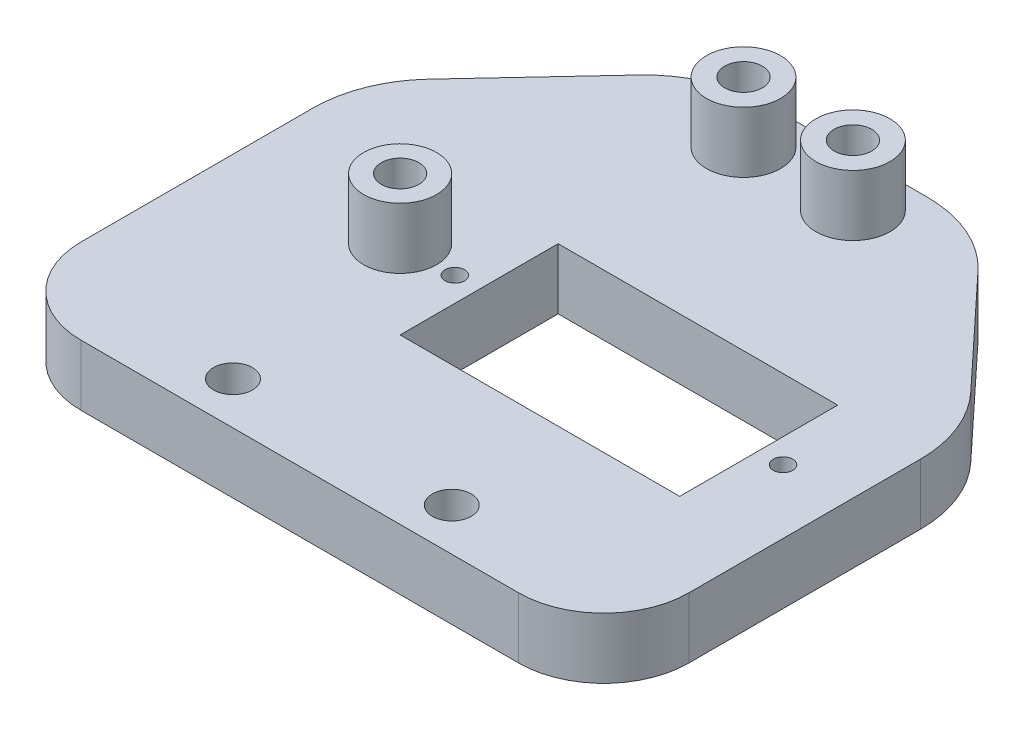
ISO-10303-21;
HEADER;
FILE_DESCRIPTION(('STEP AP214'),'2;1');
FILE_NAME('part.step','',(''),(''),'','','');
FILE_SCHEMA(('AUTOMOTIVE_DESIGN { 1 0 10303 214 1 1 1 1 }'));
ENDSEC;
DATA;
#1=APPLICATION_CONTEXT('core data for automotive mechanical design processes');
#2=APPLICATION_PROTOCOL_DEFINITION('international standard','automotive_design',2000,#1);
#3=PRODUCT_CONTEXT('',#1,'mechanical');
#4=PRODUCT('Part','Part','',(#3));
#5=PRODUCT_RELATED_PRODUCT_CATEGORY('part','',(#4));
#6=PRODUCT_DEFINITION_FORMATION('','',#4);
#7=PRODUCT_DEFINITION_CONTEXT('part definition',#1,'design');
#8=PRODUCT_DEFINITION('design','',#6,#7);
#9=PRODUCT_DEFINITION_SHAPE('','',#8);
#10=(LENGTH_UNIT() NAMED_UNIT(*) SI_UNIT(.MILLI.,.METRE.));
#11=(NAMED_UNIT(*) PLANE_ANGLE_UNIT() SI_UNIT($,.RADIAN.));
#12=(NAMED_UNIT(*) SI_UNIT($,.STERADIAN.) SOLID_ANGLE_UNIT());
#13=UNCERTAINTY_MEASURE_WITH_UNIT(LENGTH_MEASURE(1.E-05),#10,'distance_accuracy_value','');
#14=(GEOMETRIC_REPRESENTATION_CONTEXT(3) GLOBAL_UNCERTAINTY_ASSIGNED_CONTEXT((#13)) GLOBAL_UNIT_ASSIGNED_CONTEXT((#10,
#11,#12)) REPRESENTATION_CONTEXT('',''));
#15=CARTESIAN_POINT('',(0.,0.,0.));
#16=DIRECTION('',(0.,0.,1.));
#17=DIRECTION('',(1.,0.,0.));
#18=AXIS2_PLACEMENT_3D('',#15,#16,#17);
#19=CARTESIAN_POINT('',(0.,5.,0.));
#20=DIRECTION('',(0.,1.,0.));
#21=DIRECTION('',(0.,0.,1.));
#22=AXIS2_PLACEMENT_3D('',#19,#20,#21);
#23=PLANE('',#22);
#24=CARTESIAN_POINT('',(9.,5.,11.5));
#25=DIRECTION('',(0.,-1.,0.));
#26=DIRECTION('',(0.,0.,-1.));
#27=AXIS2_PLACEMENT_3D('',#24,#25,#26);
#28=CIRCLE('',#27,1.6);
#29=CARTESIAN_POINT('',(9.,5.,9.9));
#30=VERTEX_POINT('',#29);
#31=EDGE_CURVE('E505',#30,#30,#28,.T.);
#32=ORIENTED_EDGE('',*,*,#31,.T.);
#33=EDGE_LOOP('',(#32));
#34=FACE_BOUND('',#33,.T.);
#35=CARTESIAN_POINT('',(-4.5,5.,-26.));
#36=DIRECTION('',(0.,1.,0.));
#37=DIRECTION('',(0.,0.,1.));
#38=AXIS2_PLACEMENT_3D('',#35,#36,#37);
#39=CIRCLE('',#38,3.05);
#40=CARTESIAN_POINT('',(-4.5,5.,-22.95));
#41=VERTEX_POINT('',#40);
#42=EDGE_CURVE('E448',#41,#41,#39,.T.);
#43=ORIENTED_EDGE('',*,*,#42,.F.);
#44=EDGE_LOOP('',(#43));
#45=FACE_BOUND('',#44,.T.);
#46=CARTESIAN_POINT('',(-11.75,5.,-5.));
#47=DIRECTION('',(0.,1.,0.));
#48=DIRECTION('',(0.,0.,1.));
#49=AXIS2_PLACEMENT_3D('',#46,#47,#48);
#50=CIRCLE('',#49,3.);
#51=CARTESIAN_POINT('',(-11.75,5.,-2.));
#52=VERTEX_POINT('',#51);
#53=EDGE_CURVE('E440',#52,#52,#50,.T.);
#54=ORIENTED_EDGE('',*,*,#53,.F.);
#55=EDGE_LOOP('',(#54));
#56=FACE_BOUND('',#55,.T.);
#57=CARTESIAN_POINT('',(-7.25,5.,-5.));
#58=DIRECTION('',(0.,-1.,0.));
#59=DIRECTION('',(0.,0.,1.));
#60=AXIS2_PLACEMENT_3D('',#57,#58,#59);
#61=CIRCLE('',#60,0.799999999999999);
#62=CARTESIAN_POINT('',(-7.25,5.,-4.2));
#63=VERTEX_POINT('',#62);
#64=EDGE_CURVE('E443',#63,#63,#61,.T.);
#65=ORIENTED_EDGE('',*,*,#64,.T.);
#66=EDGE_LOOP('',(#65));
#67=FACE_BOUND('',#66,.T.);
#68=CARTESIAN_POINT('',(19.75,5.,-4.99999999999999));
#69=DIRECTION('',(0.,-1.,0.));
#70=DIRECTION('',(0.,0.,-1.));
#71=AXIS2_PLACEMENT_3D('',#68,#69,#70);
#72=CIRCLE('',#71,0.799999999999999);
#73=CARTESIAN_POINT('',(19.75,5.,-5.79999999999999));
#74=VERTEX_POINT('',#73);
#75=EDGE_CURVE('E197',#74,#74,#72,.T.);
#76=ORIENTED_EDGE('',*,*,#75,.T.);
#77=EDGE_LOOP('',(#76));
#78=FACE_BOUND('',#77,.T.);
#79=DIRECTION('',(0.,0.,-1.));
#80=VECTOR('',#79,1.);
#81=CARTESIAN_POINT('',(-5.25,5.,1.5));
#82=LINE('',#81,#80);
#83=CARTESIAN_POINT('',(-5.25,5.,1.5));
#84=VERTEX_POINT('',#83);
#85=CARTESIAN_POINT('',(-5.25,5.,-11.5));
#86=VERTEX_POINT('',#85);
#87=EDGE_CURVE('E165',#84,#86,#82,.T.);
#88=ORIENTED_EDGE('',*,*,#87,.T.);
#89=DIRECTION('',(1.,0.,0.));
#90=VECTOR('',#89,1.);
#91=CARTESIAN_POINT('',(-5.25,5.,-11.5));
#92=LINE('',#91,#90);
#93=CARTESIAN_POINT('',(17.75,5.,-11.5));
#94=VERTEX_POINT('',#93);
#95=EDGE_CURVE('E177',#86,#94,#92,.T.);
#96=ORIENTED_EDGE('',*,*,#95,.T.);
#97=DIRECTION('',(0.,0.,1.));
#98=VECTOR('',#97,1.);
#99=CARTESIAN_POINT('',(17.75,5.,1.5));
#100=LINE('',#99,#98);
#101=CARTESIAN_POINT('',(17.75,5.,1.5));
#102=VERTEX_POINT('',#101);
#103=EDGE_CURVE('E181',#94,#102,#100,.T.);
#104=ORIENTED_EDGE('',*,*,#103,.T.);
#105=DIRECTION('',(-1.,0.,0.));
#106=VECTOR('',#105,1.);
#107=CARTESIAN_POINT('',(-5.25,5.,1.5));
#108=LINE('',#107,#106);
#109=EDGE_CURVE('E173',#102,#84,#108,.T.);
#110=ORIENTED_EDGE('',*,*,#109,.T.);
#111=EDGE_LOOP('',(#88,#96,#104,#110));
#112=FACE_BOUND('',#111,.T.);
#113=DIRECTION('',(0.,0.,1.));
#114=VECTOR('',#113,1.);
#115=CARTESIAN_POINT('',(-25.,5.,-15.));
#116=LINE('',#115,#114);
#117=CARTESIAN_POINT('',(-25.,5.,-11.0583681937977));
#118=VERTEX_POINT('',#117);
#119=CARTESIAN_POINT('',(-25.,5.,8.));
#120=VERTEX_POINT('',#119);
#121=EDGE_CURVE('E228',#118,#120,#116,.T.);
#122=ORIENTED_EDGE('',*,*,#121,.T.);
#123=CARTESIAN_POINT('',(-18.,5.,8.));
#124=DIRECTION('',(0.,1.,0.));
#125=DIRECTION('',(0.,0.,1.));
#126=AXIS2_PLACEMENT_3D('',#123,#124,#125);
#127=CIRCLE('',#126,7.);
#128=CARTESIAN_POINT('',(-18.,5.,15.));
#129=VERTEX_POINT('',#128);
#130=EDGE_CURVE('E53',#120,#129,#127,.T.);
#131=ORIENTED_EDGE('',*,*,#130,.T.);
#132=DIRECTION('',(1.,0.,0.));
#133=VECTOR('',#132,1.);
#134=CARTESIAN_POINT('',(-25.,5.,15.));
#135=LINE('',#134,#133);
#136=CARTESIAN_POINT('',(18.,5.,15.));
#137=VERTEX_POINT('',#136);
#138=EDGE_CURVE('E230',#129,#137,#135,.T.);
#139=ORIENTED_EDGE('',*,*,#138,.T.);
#140=CARTESIAN_POINT('',(18.,5.,8.));
#141=DIRECTION('',(0.,1.,0.));
#142=DIRECTION('',(0.,0.,1.));
#143=AXIS2_PLACEMENT_3D('',#140,#141,#142);
#144=CIRCLE('',#143,7.);
#145=CARTESIAN_POINT('',(25.,5.,8.));
#146=VERTEX_POINT('',#145);
#147=EDGE_CURVE('E60',#137,#146,#144,.T.);
#148=ORIENTED_EDGE('',*,*,#147,.T.);
#149=DIRECTION('',(0.,0.,-1.));
#150=VECTOR('',#149,1.);
#151=CARTESIAN_POINT('',(25.,5.,-15.));
#152=LINE('',#151,#150);
#153=CARTESIAN_POINT('',(25.,5.,-11.0583681937977));
#154=VERTEX_POINT('',#153);
#155=EDGE_CURVE('E216',#146,#154,#152,.T.);
#156=ORIENTED_EDGE('',*,*,#155,.T.);
#157=CARTESIAN_POINT('',(15.,5.,-11.0583681937977));
#158=DIRECTION('',(0.,1.,0.));
#159=DIRECTION('',(0.,0.,1.));
#160=AXIS2_PLACEMENT_3D('',#157,#158,#159);
#161=CIRCLE('',#160,10.);
#162=CARTESIAN_POINT('',(22.3105526824287,5.,-17.8815506973978));
#163=VERTEX_POINT('',#162);
#164=EDGE_CURVE('E269',#154,#163,#161,.T.);
#165=ORIENTED_EDGE('',*,*,#164,.T.);
#166=DIRECTION('',(-0.682318250360011,0.,-0.731055268242869));
#167=VECTOR('',#166,1.);
#168=CARTESIAN_POINT('',(11.,5.,-30.));
#169=LINE('',#168,#167);
#170=CARTESIAN_POINT('',(13.9650296633066,5.,-26.8231825036001));
#171=VERTEX_POINT('',#170);
#172=EDGE_CURVE('E218',#163,#171,#169,.T.);
#173=ORIENTED_EDGE('',*,*,#172,.T.);
#174=CARTESIAN_POINT('',(6.65447698087787,5.,-20.));
#175=DIRECTION('',(0.,1.,0.));
#176=DIRECTION('',(0.,0.,1.));
#177=AXIS2_PLACEMENT_3D('',#174,#175,#176);
#178=CIRCLE('',#177,10.);
#179=CARTESIAN_POINT('',(6.65447698087787,5.,-30.));
#180=VERTEX_POINT('',#179);
#181=EDGE_CURVE('E267',#171,#180,#178,.T.);
#182=ORIENTED_EDGE('',*,*,#181,.T.);
#183=DIRECTION('',(-1.,0.,0.));
#184=VECTOR('',#183,1.);
#185=CARTESIAN_POINT('',(-11.,5.,-30.));
#186=LINE('',#185,#184);
#187=CARTESIAN_POINT('',(-6.65447698087788,5.,-30.));
#188=VERTEX_POINT('',#187);
#189=EDGE_CURVE('E222',#180,#188,#186,.T.);
#190=ORIENTED_EDGE('',*,*,#189,.T.);
#191=CARTESIAN_POINT('',(-6.65447698087788,5.,-20.));
#192=DIRECTION('',(0.,1.,0.));
#193=DIRECTION('',(0.,0.,1.));
#194=AXIS2_PLACEMENT_3D('',#191,#192,#193);
#195=CIRCLE('',#194,10.);
#196=CARTESIAN_POINT('',(-13.9650296633066,5.,-26.8231825036001));
#197=VERTEX_POINT('',#196);
#198=EDGE_CURVE('E265',#188,#197,#195,.T.);
#199=ORIENTED_EDGE('',*,*,#198,.T.);
#200=DIRECTION('',(-0.682318250360011,0.,0.731055268242869));
#201=VECTOR('',#200,1.);
#202=CARTESIAN_POINT('',(-11.,5.,-30.));
#203=LINE('',#202,#201);
#204=CARTESIAN_POINT('',(-22.3105526824287,5.,-17.8815506973978));
#205=VERTEX_POINT('',#204);
#206=EDGE_CURVE('E225',#197,#205,#203,.T.);
#207=ORIENTED_EDGE('',*,*,#206,.T.);
#208=CARTESIAN_POINT('',(-15.,5.,-11.0583681937977));
#209=DIRECTION('',(0.,1.,0.));
#210=DIRECTION('',(0.,0.,1.));
#211=AXIS2_PLACEMENT_3D('',#208,#209,#210);
#212=CIRCLE('',#211,10.);
#213=EDGE_CURVE('E263',#205,#118,#212,.T.);
#214=ORIENTED_EDGE('',*,*,#213,.T.);
#215=EDGE_LOOP('',(#122,#131,#139,#148,#156,#165,#173,#182,#190,#199,#207,#214));
#216=FACE_BOUND('',#215,.T.);
#217=CARTESIAN_POINT('',(4.5,5.,-26.));
#218=DIRECTION('',(0.,1.,0.));
#219=DIRECTION('',(0.,0.,1.));
#220=AXIS2_PLACEMENT_3D('',#217,#218,#219);
#221=CIRCLE('',#220,3.05);
#222=CARTESIAN_POINT('',(4.5,5.,-22.95));
#223=VERTEX_POINT('',#222);
#224=EDGE_CURVE('E498',#223,#223,#221,.T.);
#225=ORIENTED_EDGE('',*,*,#224,.F.);
#226=EDGE_LOOP('',(#225));
#227=FACE_BOUND('',#226,.T.);
#228=CARTESIAN_POINT('',(-9.,5.,11.5));
#229=DIRECTION('',(0.,1.,0.));
#230=DIRECTION('',(0.,0.,1.));
#231=AXIS2_PLACEMENT_3D('',#228,#229,#230);
#232=CIRCLE('',#231,1.6);
#233=CARTESIAN_POINT('',(-9.,5.,13.1));
#234=VERTEX_POINT('',#233);
#235=EDGE_CURVE('E289',#234,#234,#232,.T.);
#236=ORIENTED_EDGE('',*,*,#235,.F.);
#237=EDGE_LOOP('',(#236));
#238=FACE_BOUND('',#237,.T.);
#239=ADVANCED_FACE('F45',(#34,#45,#56,#67,#78,#112,#216,#227,#238),#23,.T.);
#240=CARTESIAN_POINT('',(0.,0.,0.));
#241=DIRECTION('',(0.,1.,0.));
#242=DIRECTION('',(0.,0.,1.));
#243=AXIS2_PLACEMENT_3D('',#240,#241,#242);
#244=PLANE('',#243);
#245=CARTESIAN_POINT('',(9.,0.,11.5));
#246=DIRECTION('',(0.,1.,0.));
#247=DIRECTION('',(0.,0.,1.));
#248=AXIS2_PLACEMENT_3D('',#245,#246,#247);
#249=CIRCLE('',#248,1.90000000000001);
#250=CARTESIAN_POINT('',(9.,0.,13.4));
#251=VERTEX_POINT('',#250);
#252=EDGE_CURVE('E295',#251,#251,#249,.T.);
#253=ORIENTED_EDGE('',*,*,#252,.T.);
#254=EDGE_LOOP('',(#253));
#255=FACE_BOUND('',#254,.T.);
#256=CARTESIAN_POINT('',(-9.,0.,11.5));
#257=DIRECTION('',(0.,1.,0.));
#258=DIRECTION('',(0.,0.,1.));
#259=AXIS2_PLACEMENT_3D('',#256,#257,#258);
#260=CIRCLE('',#259,1.89999999999999);
#261=CARTESIAN_POINT('',(-9.,0.,13.4));
#262=VERTEX_POINT('',#261);
#263=EDGE_CURVE('E292',#262,#262,#260,.T.);
#264=ORIENTED_EDGE('',*,*,#263,.T.);
#265=EDGE_LOOP('',(#264));
#266=FACE_BOUND('',#265,.T.);
#267=CARTESIAN_POINT('',(-11.75,0.,-5.));
#268=DIRECTION('',(0.,1.,0.));
#269=DIRECTION('',(0.,0.,1.));
#270=AXIS2_PLACEMENT_3D('',#267,#268,#269);
#271=CIRCLE('',#270,1.55);
#272=CARTESIAN_POINT('',(-11.75,0.,-3.45));
#273=VERTEX_POINT('',#272);
#274=EDGE_CURVE('E210',#273,#273,#271,.T.);
#275=ORIENTED_EDGE('',*,*,#274,.T.);
#276=EDGE_LOOP('',(#275));
#277=FACE_BOUND('',#276,.T.);
#278=DIRECTION('',(1.,0.,0.));
#279=VECTOR('',#278,1.);
#280=CARTESIAN_POINT('',(-25.,0.,15.));
#281=LINE('',#280,#279);
#282=CARTESIAN_POINT('',(-18.,0.,15.));
#283=VERTEX_POINT('',#282);
#284=CARTESIAN_POINT('',(18.,0.,15.));
#285=VERTEX_POINT('',#284);
#286=EDGE_CURVE('E219',#283,#285,#281,.T.);
#287=ORIENTED_EDGE('',*,*,#286,.F.);
#288=CARTESIAN_POINT('',(-18.,0.,8.));
#289=DIRECTION('',(0.,1.,0.));
#290=DIRECTION('',(0.,0.,1.));
#291=AXIS2_PLACEMENT_3D('',#288,#289,#290);
#292=CIRCLE('',#291,7.);
#293=CARTESIAN_POINT('',(-25.,0.,8.));
#294=VERTEX_POINT('',#293);
#295=EDGE_CURVE('E308',#283,#294,#292,.F.);
#296=ORIENTED_EDGE('',*,*,#295,.T.);
#297=DIRECTION('',(0.,0.,1.));
#298=VECTOR('',#297,1.);
#299=CARTESIAN_POINT('',(-25.,0.,-15.));
#300=LINE('',#299,#298);
#301=CARTESIAN_POINT('',(-25.,0.,-11.0583681937977));
#302=VERTEX_POINT('',#301);
#303=EDGE_CURVE('E243',#302,#294,#300,.T.);
#304=ORIENTED_EDGE('',*,*,#303,.F.);
#305=CARTESIAN_POINT('',(-15.,0.,-11.0583681937977));
#306=DIRECTION('',(0.,1.,0.));
#307=DIRECTION('',(0.,0.,1.));
#308=AXIS2_PLACEMENT_3D('',#305,#306,#307);
#309=CIRCLE('',#308,10.);
#310=CARTESIAN_POINT('',(-22.3105526824287,0.,-17.8815506973978));
#311=VERTEX_POINT('',#310);
#312=EDGE_CURVE('E251',#302,#311,#309,.F.);
#313=ORIENTED_EDGE('',*,*,#312,.T.);
#314=DIRECTION('',(-0.682318250360011,0.,0.731055268242869));
#315=VECTOR('',#314,1.);
#316=CARTESIAN_POINT('',(-11.,0.,-30.));
#317=LINE('',#316,#315);
#318=CARTESIAN_POINT('',(-13.9650296633066,0.,-26.8231825036001));
#319=VERTEX_POINT('',#318);
#320=EDGE_CURVE('E240',#319,#311,#317,.T.);
#321=ORIENTED_EDGE('',*,*,#320,.F.);
#322=CARTESIAN_POINT('',(-6.65447698087788,0.,-20.));
#323=DIRECTION('',(0.,1.,0.));
#324=DIRECTION('',(0.,0.,1.));
#325=AXIS2_PLACEMENT_3D('',#322,#323,#324);
#326=CIRCLE('',#325,10.);
#327=CARTESIAN_POINT('',(-6.65447698087788,0.,-30.));
#328=VERTEX_POINT('',#327);
#329=EDGE_CURVE('E253',#319,#328,#326,.F.);
#330=ORIENTED_EDGE('',*,*,#329,.T.);
#331=DIRECTION('',(-1.,0.,0.));
#332=VECTOR('',#331,1.);
#333=CARTESIAN_POINT('',(-11.,0.,-30.));
#334=LINE('',#333,#332);
#335=CARTESIAN_POINT('',(6.65447698087787,0.,-30.));
#336=VERTEX_POINT('',#335);
#337=EDGE_CURVE('E237',#336,#328,#334,.T.);
#338=ORIENTED_EDGE('',*,*,#337,.F.);
#339=CARTESIAN_POINT('',(6.65447698087787,0.,-20.));
#340=DIRECTION('',(0.,1.,0.));
#341=DIRECTION('',(0.,0.,1.));
#342=AXIS2_PLACEMENT_3D('',#339,#340,#341);
#343=CIRCLE('',#342,10.);
#344=CARTESIAN_POINT('',(13.9650296633066,0.,-26.8231825036001));
#345=VERTEX_POINT('',#344);
#346=EDGE_CURVE('E255',#336,#345,#343,.F.);
#347=ORIENTED_EDGE('',*,*,#346,.T.);
#348=DIRECTION('',(-0.682318250360011,0.,-0.731055268242869));
#349=VECTOR('',#348,1.);
#350=CARTESIAN_POINT('',(11.,0.,-30.));
#351=LINE('',#350,#349);
#352=CARTESIAN_POINT('',(22.3105526824287,0.,-17.8815506973978));
#353=VERTEX_POINT('',#352);
#354=EDGE_CURVE('E234',#353,#345,#351,.T.);
#355=ORIENTED_EDGE('',*,*,#354,.F.);
#356=CARTESIAN_POINT('',(15.,0.,-11.0583681937977));
#357=DIRECTION('',(0.,1.,0.));
#358=DIRECTION('',(0.,0.,1.));
#359=AXIS2_PLACEMENT_3D('',#356,#357,#358);
#360=CIRCLE('',#359,10.);
#361=CARTESIAN_POINT('',(25.,0.,-11.0583681937977));
#362=VERTEX_POINT('',#361);
#363=EDGE_CURVE('E257',#353,#362,#360,.F.);
#364=ORIENTED_EDGE('',*,*,#363,.T.);
#365=DIRECTION('',(0.,0.,-1.));
#366=VECTOR('',#365,1.);
#367=CARTESIAN_POINT('',(25.,0.,-15.));
#368=LINE('',#367,#366);
#369=CARTESIAN_POINT('',(25.,0.,8.));
#370=VERTEX_POINT('',#369);
#371=EDGE_CURVE('E215',#370,#362,#368,.T.);
#372=ORIENTED_EDGE('',*,*,#371,.F.);
#373=CARTESIAN_POINT('',(18.,0.,8.));
#374=DIRECTION('',(0.,1.,0.));
#375=DIRECTION('',(0.,0.,1.));
#376=AXIS2_PLACEMENT_3D('',#373,#374,#375);
#377=CIRCLE('',#376,7.);
#378=EDGE_CURVE('E306',#370,#285,#377,.F.);
#379=ORIENTED_EDGE('',*,*,#378,.T.);
#380=EDGE_LOOP('',(#287,#296,#304,#313,#321,#330,#338,#347,#355,#364,#372,#379));
#381=FACE_BOUND('',#380,.T.);
#382=CARTESIAN_POINT('',(4.5,0.,-26.));
#383=DIRECTION('',(0.,1.,0.));
#384=DIRECTION('',(0.,0.,-1.));
#385=AXIS2_PLACEMENT_3D('',#382,#383,#384);
#386=CIRCLE('',#385,1.55);
#387=CARTESIAN_POINT('',(4.5,0.,-27.55));
#388=VERTEX_POINT('',#387);
#389=EDGE_CURVE('E203',#388,#388,#386,.T.);
#390=ORIENTED_EDGE('',*,*,#389,.T.);
#391=EDGE_LOOP('',(#390));
#392=FACE_BOUND('',#391,.T.);
#393=CARTESIAN_POINT('',(-4.5,0.,-26.));
#394=DIRECTION('',(0.,1.,0.));
#395=DIRECTION('',(0.,0.,1.));
#396=AXIS2_PLACEMENT_3D('',#393,#394,#395);
#397=CIRCLE('',#396,1.55);
#398=CARTESIAN_POINT('',(-4.5,0.,-24.45));
#399=VERTEX_POINT('',#398);
#400=EDGE_CURVE('E207',#399,#399,#397,.T.);
#401=ORIENTED_EDGE('',*,*,#400,.T.);
#402=EDGE_LOOP('',(#401));
#403=FACE_BOUND('',#402,.T.);
#404=DIRECTION('',(1.,0.,0.));
#405=VECTOR('',#404,1.);
#406=CARTESIAN_POINT('',(-5.25,0.,-11.5));
#407=LINE('',#406,#405);
#408=CARTESIAN_POINT('',(-5.25,0.,-11.5));
#409=VERTEX_POINT('',#408);
#410=CARTESIAN_POINT('',(17.75,0.,-11.5));
#411=VERTEX_POINT('',#410);
#412=EDGE_CURVE('E196',#409,#411,#407,.T.);
#413=ORIENTED_EDGE('',*,*,#412,.F.);
#414=DIRECTION('',(0.,0.,-1.));
#415=VECTOR('',#414,1.);
#416=CARTESIAN_POINT('',(-5.25,0.,1.5));
#417=LINE('',#416,#415);
#418=CARTESIAN_POINT('',(-5.25,0.,1.5));
#419=VERTEX_POINT('',#418);
#420=EDGE_CURVE('E168',#419,#409,#417,.T.);
#421=ORIENTED_EDGE('',*,*,#420,.F.);
#422=DIRECTION('',(-1.,0.,0.));
#423=VECTOR('',#422,1.);
#424=CARTESIAN_POINT('',(-5.25,0.,1.5));
#425=LINE('',#424,#423);
#426=CARTESIAN_POINT('',(17.75,0.,1.5));
#427=VERTEX_POINT('',#426);
#428=EDGE_CURVE('E184',#427,#419,#425,.T.);
#429=ORIENTED_EDGE('',*,*,#428,.F.);
#430=DIRECTION('',(0.,0.,1.));
#431=VECTOR('',#430,1.);
#432=CARTESIAN_POINT('',(17.75,0.,1.5));
#433=LINE('',#432,#431);
#434=EDGE_CURVE('E187',#411,#427,#433,.T.);
#435=ORIENTED_EDGE('',*,*,#434,.F.);
#436=EDGE_LOOP('',(#413,#421,#429,#435));
#437=FACE_BOUND('',#436,.T.);
#438=CARTESIAN_POINT('',(19.75,0.,-4.99999999999999));
#439=DIRECTION('',(0.,-1.,0.));
#440=DIRECTION('',(0.,0.,-1.));
#441=AXIS2_PLACEMENT_3D('',#438,#439,#440);
#442=CIRCLE('',#441,0.799999999999999);
#443=CARTESIAN_POINT('',(19.75,0.,-5.79999999999999));
#444=VERTEX_POINT('',#443);
#445=EDGE_CURVE('E453',#444,#444,#442,.T.);
#446=ORIENTED_EDGE('',*,*,#445,.F.);
#447=EDGE_LOOP('',(#446));
#448=FACE_BOUND('',#447,.T.);
#449=CARTESIAN_POINT('',(-7.25,0.,-5.));
#450=DIRECTION('',(0.,-1.,0.));
#451=DIRECTION('',(0.,0.,1.));
#452=AXIS2_PLACEMENT_3D('',#449,#450,#451);
#453=CIRCLE('',#452,0.799999999999999);
#454=CARTESIAN_POINT('',(-7.25,0.,-4.2));
#455=VERTEX_POINT('',#454);
#456=EDGE_CURVE('E190',#455,#455,#453,.T.);
#457=ORIENTED_EDGE('',*,*,#456,.F.);
#458=EDGE_LOOP('',(#457));
#459=FACE_BOUND('',#458,.T.);
#460=ADVANCED_FACE('F323',(#255,#266,#277,#381,#392,#403,#437,#448,#459),#244,.F.);
#461=CARTESIAN_POINT('',(25.,5.,-15.));
#462=DIRECTION('',(-1.,0.,0.));
#463=DIRECTION('',(0.,0.,1.));
#464=AXIS2_PLACEMENT_3D('',#461,#462,#463);
#465=PLANE('',#464);
#466=ORIENTED_EDGE('',*,*,#155,.F.);
#467=DIRECTION('',(0.,-1.,0.));
#468=VECTOR('',#467,1.);
#469=CARTESIAN_POINT('',(25.,5.,8.));
#470=LINE('',#469,#468);
#471=EDGE_CURVE('E11',#146,#370,#470,.T.);
#472=ORIENTED_EDGE('',*,*,#471,.T.);
#473=ORIENTED_EDGE('',*,*,#371,.T.);
#474=DIRECTION('',(0.,-1.,0.));
#475=VECTOR('',#474,1.);
#476=CARTESIAN_POINT('',(25.,5.,-11.0583681937977));
#477=LINE('',#476,#475);
#478=EDGE_CURVE('E260',#362,#154,#477,.F.);
#479=ORIENTED_EDGE('',*,*,#478,.T.);
#480=EDGE_LOOP('',(#466,#472,#473,#479));
#481=FACE_BOUND('',#480,.T.);
#482=ADVANCED_FACE('F360',(#481),#465,.F.);
#483=CARTESIAN_POINT('',(11.,5.,-30.));
#484=DIRECTION('',(-0.731055268242869,0.,0.682318250360011));
#485=DIRECTION('',(0.682318250360011,0.,0.731055268242869));
#486=AXIS2_PLACEMENT_3D('',#483,#484,#485);
#487=PLANE('',#486);
#488=ORIENTED_EDGE('',*,*,#172,.F.);
#489=DIRECTION('',(0.,-1.,0.));
#490=VECTOR('',#489,1.);
#491=CARTESIAN_POINT('',(22.3105526824287,5.,-17.8815506973978));
#492=LINE('',#491,#490);
#493=EDGE_CURVE('E248',#163,#353,#492,.T.);
#494=ORIENTED_EDGE('',*,*,#493,.T.);
#495=ORIENTED_EDGE('',*,*,#354,.T.);
#496=DIRECTION('',(0.,-1.,0.));
#497=VECTOR('',#496,1.);
#498=CARTESIAN_POINT('',(13.9650296633066,5.,-26.8231825036001));
#499=LINE('',#498,#497);
#500=EDGE_CURVE('E232',#345,#171,#499,.F.);
#501=ORIENTED_EDGE('',*,*,#500,.T.);
#502=EDGE_LOOP('',(#488,#494,#495,#501));
#503=FACE_BOUND('',#502,.T.);
#504=ADVANCED_FACE('F352',(#503),#487,.F.);
#505=CARTESIAN_POINT('',(-11.,5.,-30.));
#506=DIRECTION('',(0.,0.,1.));
#507=DIRECTION('',(1.,0.,0.));
#508=AXIS2_PLACEMENT_3D('',#505,#506,#507);
#509=PLANE('',#508);
#510=ORIENTED_EDGE('',*,*,#189,.F.);
#511=DIRECTION('',(0.,-1.,0.));
#512=VECTOR('',#511,1.);
#513=CARTESIAN_POINT('',(6.65447698087787,5.,-30.));
#514=LINE('',#513,#512);
#515=EDGE_CURVE('E273',#180,#336,#514,.T.);
#516=ORIENTED_EDGE('',*,*,#515,.T.);
#517=ORIENTED_EDGE('',*,*,#337,.T.);
#518=DIRECTION('',(0.,-1.,0.));
#519=VECTOR('',#518,1.);
#520=CARTESIAN_POINT('',(-6.65447698087788,5.,-30.));
#521=LINE('',#520,#519);
#522=EDGE_CURVE('E271',#328,#188,#521,.F.);
#523=ORIENTED_EDGE('',*,*,#522,.T.);
#524=EDGE_LOOP('',(#510,#516,#517,#523));
#525=FACE_BOUND('',#524,.T.);
#526=ADVANCED_FACE('F343',(#525),#509,.F.);
#527=CARTESIAN_POINT('',(-11.,5.,-30.));
#528=DIRECTION('',(0.731055268242869,0.,0.682318250360011));
#529=DIRECTION('',(0.682318250360011,0.,-0.731055268242869));
#530=AXIS2_PLACEMENT_3D('',#527,#528,#529);
#531=PLANE('',#530);
#532=ORIENTED_EDGE('',*,*,#206,.F.);
#533=DIRECTION('',(0.,-1.,0.));
#534=VECTOR('',#533,1.);
#535=CARTESIAN_POINT('',(-13.9650296633066,5.,-26.8231825036001));
#536=LINE('',#535,#534);
#537=EDGE_CURVE('E278',#197,#319,#536,.T.);
#538=ORIENTED_EDGE('',*,*,#537,.T.);
#539=ORIENTED_EDGE('',*,*,#320,.T.);
#540=DIRECTION('',(0.,-1.,0.));
#541=VECTOR('',#540,1.);
#542=CARTESIAN_POINT('',(-22.3105526824287,5.,-17.8815506973978));
#543=LINE('',#542,#541);
#544=EDGE_CURVE('E276',#311,#205,#543,.F.);
#545=ORIENTED_EDGE('',*,*,#544,.T.);
#546=EDGE_LOOP('',(#532,#538,#539,#545));
#547=FACE_BOUND('',#546,.T.);
#548=ADVANCED_FACE('F334',(#547),#531,.F.);
#549=CARTESIAN_POINT('',(-25.,5.,-15.));
#550=DIRECTION('',(1.,0.,0.));
#551=DIRECTION('',(0.,0.,-1.));
#552=AXIS2_PLACEMENT_3D('',#549,#550,#551);
#553=PLANE('',#552);
#554=ORIENTED_EDGE('',*,*,#303,.T.);
#555=DIRECTION('',(0.,-1.,0.));
#556=VECTOR('',#555,1.);
#557=CARTESIAN_POINT('',(-25.,5.,8.));
#558=LINE('',#557,#556);
#559=EDGE_CURVE('E68',#294,#120,#558,.F.);
#560=ORIENTED_EDGE('',*,*,#559,.T.);
#561=ORIENTED_EDGE('',*,*,#121,.F.);
#562=DIRECTION('',(0.,-1.,0.));
#563=VECTOR('',#562,1.);
#564=CARTESIAN_POINT('',(-25.,5.,-11.0583681937977));
#565=LINE('',#564,#563);
#566=EDGE_CURVE('E281',#118,#302,#565,.T.);
#567=ORIENTED_EDGE('',*,*,#566,.T.);
#568=EDGE_LOOP('',(#554,#560,#561,#567));
#569=FACE_BOUND('',#568,.T.);
#570=ADVANCED_FACE('F325',(#569),#553,.F.);
#571=CARTESIAN_POINT('',(-25.,5.,15.));
#572=DIRECTION('',(0.,0.,-1.));
#573=DIRECTION('',(-1.,0.,0.));
#574=AXIS2_PLACEMENT_3D('',#571,#572,#573);
#575=PLANE('',#574);
#576=ORIENTED_EDGE('',*,*,#138,.F.);
#577=DIRECTION('',(0.,-1.,0.));
#578=VECTOR('',#577,1.);
#579=CARTESIAN_POINT('',(-18.,5.,15.));
#580=LINE('',#579,#578);
#581=EDGE_CURVE('E303',#129,#283,#580,.T.);
#582=ORIENTED_EDGE('',*,*,#581,.T.);
#583=ORIENTED_EDGE('',*,*,#286,.T.);
#584=DIRECTION('',(0.,-1.,0.));
#585=VECTOR('',#584,1.);
#586=CARTESIAN_POINT('',(18.,5.,15.));
#587=LINE('',#586,#585);
#588=EDGE_CURVE('E301',#285,#137,#587,.F.);
#589=ORIENTED_EDGE('',*,*,#588,.T.);
#590=EDGE_LOOP('',(#576,#582,#583,#589));
#591=FACE_BOUND('',#590,.T.);
#592=ADVANCED_FACE('F317',(#591),#575,.F.);
#593=CARTESIAN_POINT('',(-11.75,5.,-5.));
#594=DIRECTION('',(0.,-1.,0.));
#595=DIRECTION('',(0.,0.,-1.));
#596=AXIS2_PLACEMENT_3D('',#593,#594,#595);
#597=CYLINDRICAL_SURFACE('',#596,1.55);
#598=ORIENTED_EDGE('',*,*,#274,.F.);
#599=EDGE_LOOP('',(#598));
#600=FACE_BOUND('',#599,.T.);
#601=CARTESIAN_POINT('',(-11.75,10.,-5.));
#602=DIRECTION('',(0.,1.,0.));
#603=DIRECTION('',(0.,0.,1.));
#604=AXIS2_PLACEMENT_3D('',#601,#602,#603);
#605=CIRCLE('',#604,1.55);
#606=CARTESIAN_POINT('',(-11.75,10.,-3.45));
#607=VERTEX_POINT('',#606);
#608=EDGE_CURVE('E285',#607,#607,#605,.T.);
#609=ORIENTED_EDGE('',*,*,#608,.T.);
#610=EDGE_LOOP('',(#609));
#611=FACE_BOUND('',#610,.T.);
#612=ADVANCED_FACE('F380',(#600,#611),#597,.F.);
#613=CARTESIAN_POINT('',(4.5,0.,-26.));
#614=DIRECTION('',(0.,1.,0.));
#615=DIRECTION('',(0.,0.,1.));
#616=AXIS2_PLACEMENT_3D('',#613,#614,#615);
#617=CYLINDRICAL_SURFACE('',#616,1.55);
#618=ORIENTED_EDGE('',*,*,#389,.F.);
#619=EDGE_LOOP('',(#618));
#620=FACE_BOUND('',#619,.T.);
#621=CARTESIAN_POINT('',(4.5,10.,-26.));
#622=DIRECTION('',(0.,1.,0.));
#623=DIRECTION('',(0.,0.,1.));
#624=AXIS2_PLACEMENT_3D('',#621,#622,#623);
#625=CIRCLE('',#624,1.55);
#626=CARTESIAN_POINT('',(4.5,10.,-24.45));
#627=VERTEX_POINT('',#626);
#628=EDGE_CURVE('E288',#627,#627,#625,.T.);
#629=ORIENTED_EDGE('',*,*,#628,.T.);
#630=EDGE_LOOP('',(#629));
#631=FACE_BOUND('',#630,.T.);
#632=ADVANCED_FACE('F427',(#620,#631),#617,.F.);
#633=CARTESIAN_POINT('',(-4.5,0.,-26.));
#634=DIRECTION('',(0.,1.,0.));
#635=DIRECTION('',(0.,0.,1.));
#636=AXIS2_PLACEMENT_3D('',#633,#634,#635);
#637=CYLINDRICAL_SURFACE('',#636,1.55);
#638=ORIENTED_EDGE('',*,*,#400,.F.);
#639=EDGE_LOOP('',(#638));
#640=FACE_BOUND('',#639,.T.);
#641=CARTESIAN_POINT('',(-4.5,10.,-26.));
#642=DIRECTION('',(0.,1.,0.));
#643=DIRECTION('',(0.,0.,1.));
#644=AXIS2_PLACEMENT_3D('',#641,#642,#643);
#645=CIRCLE('',#644,1.55);
#646=CARTESIAN_POINT('',(-4.5,10.,-24.45));
#647=VERTEX_POINT('',#646);
#648=EDGE_CURVE('E508',#647,#647,#645,.T.);
#649=ORIENTED_EDGE('',*,*,#648,.T.);
#650=EDGE_LOOP('',(#649));
#651=FACE_BOUND('',#650,.T.);
#652=ADVANCED_FACE('F397',(#640,#651),#637,.F.);
#653=CARTESIAN_POINT('',(15.,5.,-11.0583681937977));
#654=DIRECTION('',(0.,-1.,0.));
#655=DIRECTION('',(0.,0.,-1.));
#656=AXIS2_PLACEMENT_3D('',#653,#654,#655);
#657=CYLINDRICAL_SURFACE('',#656,10.);
#658=ORIENTED_EDGE('',*,*,#164,.F.);
#659=ORIENTED_EDGE('',*,*,#478,.F.);
#660=ORIENTED_EDGE('',*,*,#363,.F.);
#661=ORIENTED_EDGE('',*,*,#493,.F.);
#662=EDGE_LOOP('',(#658,#659,#660,#661));
#663=FACE_BOUND('',#662,.T.);
#664=ADVANCED_FACE('F356',(#663),#657,.T.);
#665=CARTESIAN_POINT('',(6.65447698087787,5.,-20.));
#666=DIRECTION('',(0.,-1.,0.));
#667=DIRECTION('',(0.,0.,-1.));
#668=AXIS2_PLACEMENT_3D('',#665,#666,#667);
#669=CYLINDRICAL_SURFACE('',#668,10.);
#670=ORIENTED_EDGE('',*,*,#181,.F.);
#671=ORIENTED_EDGE('',*,*,#500,.F.);
#672=ORIENTED_EDGE('',*,*,#346,.F.);
#673=ORIENTED_EDGE('',*,*,#515,.F.);
#674=EDGE_LOOP('',(#670,#671,#672,#673));
#675=FACE_BOUND('',#674,.T.);
#676=ADVANCED_FACE('F347',(#675),#669,.T.);
#677=CARTESIAN_POINT('',(-6.65447698087788,5.,-20.));
#678=DIRECTION('',(0.,-1.,0.));
#679=DIRECTION('',(0.,0.,-1.));
#680=AXIS2_PLACEMENT_3D('',#677,#678,#679);
#681=CYLINDRICAL_SURFACE('',#680,10.);
#682=ORIENTED_EDGE('',*,*,#198,.F.);
#683=ORIENTED_EDGE('',*,*,#522,.F.);
#684=ORIENTED_EDGE('',*,*,#329,.F.);
#685=ORIENTED_EDGE('',*,*,#537,.F.);
#686=EDGE_LOOP('',(#682,#683,#684,#685));
#687=FACE_BOUND('',#686,.T.);
#688=ADVANCED_FACE('F338',(#687),#681,.T.);
#689=CARTESIAN_POINT('',(-15.,5.,-11.0583681937977));
#690=DIRECTION('',(0.,-1.,0.));
#691=DIRECTION('',(0.,0.,-1.));
#692=AXIS2_PLACEMENT_3D('',#689,#690,#691);
#693=CYLINDRICAL_SURFACE('',#692,10.);
#694=ORIENTED_EDGE('',*,*,#213,.F.);
#695=ORIENTED_EDGE('',*,*,#544,.F.);
#696=ORIENTED_EDGE('',*,*,#312,.F.);
#697=ORIENTED_EDGE('',*,*,#566,.F.);
#698=EDGE_LOOP('',(#694,#695,#696,#697));
#699=FACE_BOUND('',#698,.T.);
#700=ADVANCED_FACE('F329',(#699),#693,.T.);
#701=CARTESIAN_POINT('',(-5.25,5.,1.5));
#702=DIRECTION('',(-1.,0.,0.));
#703=DIRECTION('',(0.,0.,1.));
#704=AXIS2_PLACEMENT_3D('',#701,#702,#703);
#705=PLANE('',#704);
#706=ORIENTED_EDGE('',*,*,#420,.T.);
#707=DIRECTION('',(0.,-1.,0.));
#708=VECTOR('',#707,1.);
#709=CARTESIAN_POINT('',(-5.25,5.,-11.5));
#710=LINE('',#709,#708);
#711=EDGE_CURVE('E161',#86,#409,#710,.T.);
#712=ORIENTED_EDGE('',*,*,#711,.F.);
#713=ORIENTED_EDGE('',*,*,#87,.F.);
#714=DIRECTION('',(0.,-1.,0.));
#715=VECTOR('',#714,1.);
#716=CARTESIAN_POINT('',(-5.25,5.,1.5));
#717=LINE('',#716,#715);
#718=EDGE_CURVE('E201',#84,#419,#717,.T.);
#719=ORIENTED_EDGE('',*,*,#718,.T.);
#720=EDGE_LOOP('',(#706,#712,#713,#719));
#721=FACE_BOUND('',#720,.T.);
#722=ADVANCED_FACE('F163',(#721),#705,.F.);
#723=CARTESIAN_POINT('',(-5.25,5.,1.5));
#724=DIRECTION('',(0.,0.,1.));
#725=DIRECTION('',(1.,0.,0.));
#726=AXIS2_PLACEMENT_3D('',#723,#724,#725);
#727=PLANE('',#726);
#728=ORIENTED_EDGE('',*,*,#428,.T.);
#729=ORIENTED_EDGE('',*,*,#718,.F.);
#730=ORIENTED_EDGE('',*,*,#109,.F.);
#731=DIRECTION('',(0.,-1.,0.));
#732=VECTOR('',#731,1.);
#733=CARTESIAN_POINT('',(17.75,5.,1.5));
#734=LINE('',#733,#732);
#735=EDGE_CURVE('E204',#102,#427,#734,.T.);
#736=ORIENTED_EDGE('',*,*,#735,.T.);
#737=EDGE_LOOP('',(#728,#729,#730,#736));
#738=FACE_BOUND('',#737,.T.);
#739=ADVANCED_FACE('F476',(#738),#727,.F.);
#740=CARTESIAN_POINT('',(17.75,5.,1.5));
#741=DIRECTION('',(1.,0.,0.));
#742=DIRECTION('',(0.,0.,-1.));
#743=AXIS2_PLACEMENT_3D('',#740,#741,#742);
#744=PLANE('',#743);
#745=ORIENTED_EDGE('',*,*,#434,.T.);
#746=ORIENTED_EDGE('',*,*,#735,.F.);
#747=ORIENTED_EDGE('',*,*,#103,.F.);
#748=DIRECTION('',(0.,-1.,0.));
#749=VECTOR('',#748,1.);
#750=CARTESIAN_POINT('',(17.75,5.,-11.5));
#751=LINE('',#750,#749);
#752=EDGE_CURVE('E172',#94,#411,#751,.T.);
#753=ORIENTED_EDGE('',*,*,#752,.T.);
#754=EDGE_LOOP('',(#745,#746,#747,#753));
#755=FACE_BOUND('',#754,.T.);
#756=ADVANCED_FACE('F479',(#755),#744,.F.);
#757=CARTESIAN_POINT('',(-5.25,5.,-11.5));
#758=DIRECTION('',(0.,0.,-1.));
#759=DIRECTION('',(-1.,0.,0.));
#760=AXIS2_PLACEMENT_3D('',#757,#758,#759);
#761=PLANE('',#760);
#762=ORIENTED_EDGE('',*,*,#412,.T.);
#763=ORIENTED_EDGE('',*,*,#752,.F.);
#764=ORIENTED_EDGE('',*,*,#95,.F.);
#765=ORIENTED_EDGE('',*,*,#711,.T.);
#766=EDGE_LOOP('',(#762,#763,#764,#765));
#767=FACE_BOUND('',#766,.T.);
#768=ADVANCED_FACE('F178',(#767),#761,.F.);
#769=CARTESIAN_POINT('',(19.75,5.,-4.99999999999999));
#770=DIRECTION('',(0.,-1.,0.));
#771=DIRECTION('',(0.,0.,-1.));
#772=AXIS2_PLACEMENT_3D('',#769,#770,#771);
#773=CYLINDRICAL_SURFACE('',#772,0.799999999999999);
#774=ORIENTED_EDGE('',*,*,#75,.F.);
#775=EDGE_LOOP('',(#774));
#776=FACE_BOUND('',#775,.T.);
#777=ORIENTED_EDGE('',*,*,#445,.T.);
#778=EDGE_LOOP('',(#777));
#779=FACE_BOUND('',#778,.T.);
#780=ADVANCED_FACE('F463',(#776,#779),#773,.F.);
#781=CARTESIAN_POINT('',(-7.25,5.,-5.));
#782=DIRECTION('',(0.,-1.,0.));
#783=DIRECTION('',(0.,0.,-1.));
#784=AXIS2_PLACEMENT_3D('',#781,#782,#783);
#785=CYLINDRICAL_SURFACE('',#784,0.799999999999999);
#786=ORIENTED_EDGE('',*,*,#64,.F.);
#787=EDGE_LOOP('',(#786));
#788=FACE_BOUND('',#787,.T.);
#789=ORIENTED_EDGE('',*,*,#456,.T.);
#790=EDGE_LOOP('',(#789));
#791=FACE_BOUND('',#790,.T.);
#792=ADVANCED_FACE('F460',(#788,#791),#785,.F.);
#793=CARTESIAN_POINT('',(-11.75,10.,-5.));
#794=DIRECTION('',(0.,-1.,0.));
#795=DIRECTION('',(0.,0.,-1.));
#796=AXIS2_PLACEMENT_3D('',#793,#794,#795);
#797=CYLINDRICAL_SURFACE('',#796,3.);
#798=CARTESIAN_POINT('',(-11.75,10.,-5.));
#799=DIRECTION('',(0.,1.,0.));
#800=DIRECTION('',(0.,0.,1.));
#801=AXIS2_PLACEMENT_3D('',#798,#799,#800);
#802=CIRCLE('',#801,3.);
#803=CARTESIAN_POINT('',(-11.75,10.,-2.));
#804=VERTEX_POINT('',#803);
#805=EDGE_CURVE('E438',#804,#804,#802,.T.);
#806=ORIENTED_EDGE('',*,*,#805,.F.);
#807=EDGE_LOOP('',(#806));
#808=FACE_BOUND('',#807,.T.);
#809=ORIENTED_EDGE('',*,*,#53,.T.);
#810=EDGE_LOOP('',(#809));
#811=FACE_BOUND('',#810,.T.);
#812=ADVANCED_FACE('F434',(#808,#811),#797,.T.);
#813=CARTESIAN_POINT('',(-11.75,10.,-5.));
#814=DIRECTION('',(0.,1.,0.));
#815=DIRECTION('',(0.,0.,1.));
#816=AXIS2_PLACEMENT_3D('',#813,#814,#815);
#817=PLANE('',#816);
#818=ORIENTED_EDGE('',*,*,#608,.F.);
#819=EDGE_LOOP('',(#818));
#820=FACE_BOUND('',#819,.T.);
#821=ORIENTED_EDGE('',*,*,#805,.T.);
#822=EDGE_LOOP('',(#821));
#823=FACE_BOUND('',#822,.T.);
#824=ADVANCED_FACE('F430',(#820,#823),#817,.T.);
#825=CARTESIAN_POINT('',(-4.5,10.,-26.));
#826=DIRECTION('',(0.,1.,0.));
#827=DIRECTION('',(0.,0.,1.));
#828=AXIS2_PLACEMENT_3D('',#825,#826,#827);
#829=PLANE('',#828);
#830=CARTESIAN_POINT('',(-4.5,10.,-26.));
#831=DIRECTION('',(0.,1.,0.));
#832=DIRECTION('',(0.,0.,1.));
#833=AXIS2_PLACEMENT_3D('',#830,#831,#832);
#834=CIRCLE('',#833,3.05);
#835=CARTESIAN_POINT('',(-4.5,10.,-22.95));
#836=VERTEX_POINT('',#835);
#837=EDGE_CURVE('E445',#836,#836,#834,.T.);
#838=ORIENTED_EDGE('',*,*,#837,.T.);
#839=EDGE_LOOP('',(#838));
#840=FACE_BOUND('',#839,.T.);
#841=ORIENTED_EDGE('',*,*,#648,.F.);
#842=EDGE_LOOP('',(#841));
#843=FACE_BOUND('',#842,.T.);
#844=ADVANCED_FACE('F433',(#840,#843),#829,.T.);
#845=CARTESIAN_POINT('',(-4.5,10.,-26.));
#846=DIRECTION('',(0.,-1.,0.));
#847=DIRECTION('',(0.,0.,-1.));
#848=AXIS2_PLACEMENT_3D('',#845,#846,#847);
#849=CYLINDRICAL_SURFACE('',#848,3.05);
#850=ORIENTED_EDGE('',*,*,#837,.F.);
#851=EDGE_LOOP('',(#850));
#852=FACE_BOUND('',#851,.T.);
#853=ORIENTED_EDGE('',*,*,#42,.T.);
#854=EDGE_LOOP('',(#853));
#855=FACE_BOUND('',#854,.T.);
#856=ADVANCED_FACE('F517',(#852,#855),#849,.T.);
#857=CARTESIAN_POINT('',(4.5,10.,-26.));
#858=DIRECTION('',(0.,1.,0.));
#859=DIRECTION('',(0.,0.,1.));
#860=AXIS2_PLACEMENT_3D('',#857,#858,#859);
#861=PLANE('',#860);
#862=CARTESIAN_POINT('',(4.5,10.,-26.));
#863=DIRECTION('',(0.,1.,0.));
#864=DIRECTION('',(0.,0.,1.));
#865=AXIS2_PLACEMENT_3D('',#862,#863,#864);
#866=CIRCLE('',#865,3.05);
#867=CARTESIAN_POINT('',(4.5,10.,-22.95));
#868=VERTEX_POINT('',#867);
#869=EDGE_CURVE('E501',#868,#868,#866,.T.);
#870=ORIENTED_EDGE('',*,*,#869,.T.);
#871=EDGE_LOOP('',(#870));
#872=FACE_BOUND('',#871,.T.);
#873=ORIENTED_EDGE('',*,*,#628,.F.);
#874=EDGE_LOOP('',(#873));
#875=FACE_BOUND('',#874,.T.);
#876=ADVANCED_FACE('F522',(#872,#875),#861,.T.);
#877=CARTESIAN_POINT('',(4.5,10.,-26.));
#878=DIRECTION('',(0.,-1.,0.));
#879=DIRECTION('',(0.,0.,-1.));
#880=AXIS2_PLACEMENT_3D('',#877,#878,#879);
#881=CYLINDRICAL_SURFACE('',#880,3.05);
#882=ORIENTED_EDGE('',*,*,#869,.F.);
#883=EDGE_LOOP('',(#882));
#884=FACE_BOUND('',#883,.T.);
#885=ORIENTED_EDGE('',*,*,#224,.T.);
#886=EDGE_LOOP('',(#885));
#887=FACE_BOUND('',#886,.T.);
#888=ADVANCED_FACE('F529',(#884,#887),#881,.T.);
#889=CARTESIAN_POINT('',(9.,-5.,11.5));
#890=DIRECTION('',(0.,1.,0.));
#891=DIRECTION('',(0.,0.,1.));
#892=AXIS2_PLACEMENT_3D('',#889,#890,#891);
#893=CYLINDRICAL_SURFACE('',#892,1.6);
#894=CARTESIAN_POINT('',(9.,0.300000000000016,11.5));
#895=DIRECTION('',(0.,1.,0.));
#896=DIRECTION('',(0.,0.,1.));
#897=AXIS2_PLACEMENT_3D('',#894,#895,#896);
#898=CIRCLE('',#897,1.6);
#899=CARTESIAN_POINT('',(9.,0.300000000000016,13.1));
#900=VERTEX_POINT('',#899);
#901=EDGE_CURVE('E284',#900,#900,#898,.F.);
#902=ORIENTED_EDGE('',*,*,#901,.T.);
#903=EDGE_LOOP('',(#902));
#904=FACE_BOUND('',#903,.T.);
#905=ORIENTED_EDGE('',*,*,#31,.F.);
#906=EDGE_LOOP('',(#905));
#907=FACE_BOUND('',#906,.T.);
#908=ADVANCED_FACE('F535',(#904,#907),#893,.F.);
#909=CARTESIAN_POINT('',(-9.,-5.,11.5));
#910=DIRECTION('',(0.,1.,0.));
#911=DIRECTION('',(0.,0.,1.));
#912=AXIS2_PLACEMENT_3D('',#909,#910,#911);
#913=CYLINDRICAL_SURFACE('',#912,1.6);
#914=CARTESIAN_POINT('',(-9.,0.299999999999997,11.5));
#915=DIRECTION('',(0.,1.,0.));
#916=DIRECTION('',(0.,0.,1.));
#917=AXIS2_PLACEMENT_3D('',#914,#915,#916);
#918=CIRCLE('',#917,1.6);
#919=CARTESIAN_POINT('',(-9.,0.299999999999997,13.1));
#920=VERTEX_POINT('',#919);
#921=EDGE_CURVE('E298',#920,#920,#918,.F.);
#922=ORIENTED_EDGE('',*,*,#921,.T.);
#923=EDGE_LOOP('',(#922));
#924=FACE_BOUND('',#923,.T.);
#925=ORIENTED_EDGE('',*,*,#235,.T.);
#926=EDGE_LOOP('',(#925));
#927=FACE_BOUND('',#926,.T.);
#928=ADVANCED_FACE('F411',(#924,#927),#913,.F.);
#929=CARTESIAN_POINT('',(9.,0.300000000000016,11.5));
#930=DIRECTION('',(0.,-1.,0.));
#931=DIRECTION('',(0.,0.,-1.));
#932=AXIS2_PLACEMENT_3D('',#929,#930,#931);
#933=CONICAL_SURFACE('',#932,1.6,0.785398163397442);
#934=ORIENTED_EDGE('',*,*,#252,.F.);
#935=EDGE_LOOP('',(#934));
#936=FACE_BOUND('',#935,.T.);
#937=ORIENTED_EDGE('',*,*,#901,.F.);
#938=EDGE_LOOP('',(#937));
#939=FACE_BOUND('',#938,.T.);
#940=ADVANCED_FACE('F405',(#936,#939),#933,.F.);
#941=CARTESIAN_POINT('',(-9.,0.,11.5));
#942=DIRECTION('',(0.,-1.,0.));
#943=DIRECTION('',(0.,0.,-1.));
#944=AXIS2_PLACEMENT_3D('',#941,#942,#943);
#945=CONICAL_SURFACE('',#944,1.89999999999999,0.785398163397436);
#946=ORIENTED_EDGE('',*,*,#921,.F.);
#947=EDGE_LOOP('',(#946));
#948=FACE_BOUND('',#947,.T.);
#949=ORIENTED_EDGE('',*,*,#263,.F.);
#950=EDGE_LOOP('',(#949));
#951=FACE_BOUND('',#950,.T.);
#952=ADVANCED_FACE('F367',(#948,#951),#945,.F.);
#953=CARTESIAN_POINT('',(-18.,5.,8.));
#954=DIRECTION('',(0.,-1.,0.));
#955=DIRECTION('',(0.,0.,-1.));
#956=AXIS2_PLACEMENT_3D('',#953,#954,#955);
#957=CYLINDRICAL_SURFACE('',#956,7.);
#958=ORIENTED_EDGE('',*,*,#130,.F.);
#959=ORIENTED_EDGE('',*,*,#559,.F.);
#960=ORIENTED_EDGE('',*,*,#295,.F.);
#961=ORIENTED_EDGE('',*,*,#581,.F.);
#962=EDGE_LOOP('',(#958,#959,#960,#961));
#963=FACE_BOUND('',#962,.T.);
#964=ADVANCED_FACE('F320',(#963),#957,.T.);
#965=CARTESIAN_POINT('',(18.,5.,8.));
#966=DIRECTION('',(0.,-1.,0.));
#967=DIRECTION('',(0.,0.,-1.));
#968=AXIS2_PLACEMENT_3D('',#965,#966,#967);
#969=CYLINDRICAL_SURFACE('',#968,7.);
#970=ORIENTED_EDGE('',*,*,#147,.F.);
#971=ORIENTED_EDGE('',*,*,#588,.F.);
#972=ORIENTED_EDGE('',*,*,#378,.F.);
#973=ORIENTED_EDGE('',*,*,#471,.F.);
#974=EDGE_LOOP('',(#970,#971,#972,#973));
#975=FACE_BOUND('',#974,.T.);
#976=ADVANCED_FACE('F47',(#975),#969,.T.);
#977=CLOSED_SHELL('',(#239,#460,#482,#504,#526,#548,#570,#592,#612,#632,#652,#664,#676,#688,
#700,#722,#739,#756,#768,#780,#792,#812,#824,#844,#856,#876,#888,#908,#928,#940,#952,#964,#976));
#978=MANIFOLD_SOLID_BREP('B2',#977);
#979=ADVANCED_BREP_SHAPE_REPRESENTATION('',(#18,#978),#14);
#980=SHAPE_DEFINITION_REPRESENTATION(#9,#979);
ENDSEC;
END-ISO-10303-21;
